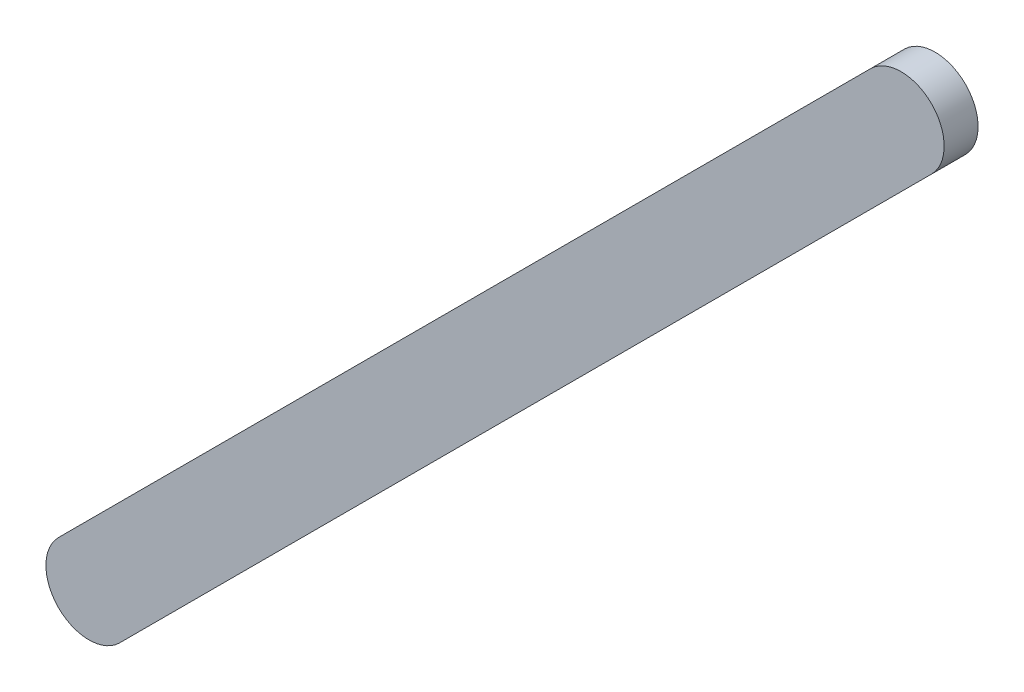
ISO-10303-21;
HEADER;
FILE_DESCRIPTION(('STEP AP214'),'2;1');
FILE_NAME('part.step','',(''),(''),'','','');
FILE_SCHEMA(('AUTOMOTIVE_DESIGN { 1 0 10303 214 1 1 1 1 }'));
ENDSEC;
DATA;
#1=APPLICATION_CONTEXT('core data for automotive mechanical design processes');
#2=APPLICATION_PROTOCOL_DEFINITION('international standard','automotive_design',2000,#1);
#3=PRODUCT_CONTEXT('',#1,'mechanical');
#4=PRODUCT('Part','Part','',(#3));
#5=PRODUCT_RELATED_PRODUCT_CATEGORY('part','',(#4));
#6=PRODUCT_DEFINITION_FORMATION('','',#4);
#7=PRODUCT_DEFINITION_CONTEXT('part definition',#1,'design');
#8=PRODUCT_DEFINITION('design','',#6,#7);
#9=PRODUCT_DEFINITION_SHAPE('','',#8);
#10=(LENGTH_UNIT() NAMED_UNIT(*) SI_UNIT(.MILLI.,.METRE.));
#11=(NAMED_UNIT(*) PLANE_ANGLE_UNIT() SI_UNIT($,.RADIAN.));
#12=(NAMED_UNIT(*) SI_UNIT($,.STERADIAN.) SOLID_ANGLE_UNIT());
#13=UNCERTAINTY_MEASURE_WITH_UNIT(LENGTH_MEASURE(1.E-05),#10,'distance_accuracy_value','');
#14=(GEOMETRIC_REPRESENTATION_CONTEXT(3) GLOBAL_UNCERTAINTY_ASSIGNED_CONTEXT((#13)) GLOBAL_UNIT_ASSIGNED_CONTEXT((#10,
#11,#12)) REPRESENTATION_CONTEXT('',''));
#15=CARTESIAN_POINT('',(0.,0.,0.));
#16=DIRECTION('',(0.,0.,1.));
#17=DIRECTION('',(1.,0.,0.));
#18=AXIS2_PLACEMENT_3D('',#15,#16,#17);
#19=CARTESIAN_POINT('',(141.8315426,59.84059406,0.));
#20=DIRECTION('',(-0.707106781186548,0.707106781186548,0.));
#21=DIRECTION('',(0.707106781186548,0.707106781186548,0.));
#22=AXIS2_PLACEMENT_3D('',#19,#20,#21);
#23=PLANE('',#22);
#24=DIRECTION('',(0.707106781186548,0.707106781186548,0.));
#25=VECTOR('',#24,1.);
#26=CARTESIAN_POINT('',(141.8315426,59.84059406,0.1999996));
#27=LINE('',#26,#25);
#28=CARTESIAN_POINT('',(141.8315426,59.84059406,0.1999996));
#29=VERTEX_POINT('',#28);
#30=CARTESIAN_POINT('',(146.62096914,64.6300206,0.1999996));
#31=VERTEX_POINT('',#30);
#32=EDGE_CURVE('E11',#29,#31,#27,.T.);
#33=ORIENTED_EDGE('',*,*,#32,.F.);
#34=DIRECTION('',(0.,0.,1.));
#35=VECTOR('',#34,1.);
#36=CARTESIAN_POINT('',(141.8315426,59.84059406,0.));
#37=LINE('',#36,#35);
#38=CARTESIAN_POINT('',(141.8315426,59.84059406,0.));
#39=VERTEX_POINT('',#38);
#40=EDGE_CURVE('E24',#39,#29,#37,.T.);
#41=ORIENTED_EDGE('',*,*,#40,.F.);
#42=DIRECTION('',(0.707106781186548,0.707106781186548,0.));
#43=VECTOR('',#42,1.);
#44=CARTESIAN_POINT('',(141.8315426,59.84059406,0.));
#45=LINE('',#44,#43);
#46=CARTESIAN_POINT('',(146.62096914,64.6300206,0.));
#47=VERTEX_POINT('',#46);
#48=EDGE_CURVE('E75',#39,#47,#45,.T.);
#49=ORIENTED_EDGE('',*,*,#48,.T.);
#50=DIRECTION('',(0.,0.,1.));
#51=VECTOR('',#50,1.);
#52=CARTESIAN_POINT('',(146.62096914,64.6300206,0.));
#53=LINE('',#52,#51);
#54=EDGE_CURVE('E37',#47,#31,#53,.T.);
#55=ORIENTED_EDGE('',*,*,#54,.T.);
#56=EDGE_LOOP('',(#33,#41,#49,#55));
#57=FACE_BOUND('',#56,.T.);
#58=ADVANCED_FACE('F17',(#57),#23,.F.);
#59=CARTESIAN_POINT('',(146.44136447,64.80962527,0.));
#60=DIRECTION('',(0.,0.,-1.));
#61=DIRECTION('',(0.707106781186548,-0.707106781186548,0.));
#62=AXIS2_PLACEMENT_3D('',#59,#60,#61);
#63=CYLINDRICAL_SURFACE('',#62,0.253999360179549);
#64=CARTESIAN_POINT('',(146.44136447,64.80962527,0.1999996));
#65=DIRECTION('',(0.,0.,1.));
#66=DIRECTION('',(0.707106781186548,-0.707106781186548,0.));
#67=AXIS2_PLACEMENT_3D('',#64,#65,#66);
#68=CIRCLE('',#67,0.253999360179549);
#69=CARTESIAN_POINT('',(146.2617598,64.98922994,0.1999996));
#70=VERTEX_POINT('',#69);
#71=EDGE_CURVE('E83',#31,#70,#68,.T.);
#72=ORIENTED_EDGE('',*,*,#71,.F.);
#73=ORIENTED_EDGE('',*,*,#54,.F.);
#74=CARTESIAN_POINT('',(146.44136447,64.80962527,0.));
#75=DIRECTION('',(0.,0.,1.));
#76=DIRECTION('',(0.707106781186548,-0.707106781186548,0.));
#77=AXIS2_PLACEMENT_3D('',#74,#75,#76);
#78=CIRCLE('',#77,0.253999360179549);
#79=CARTESIAN_POINT('',(146.2617598,64.98922994,0.));
#80=VERTEX_POINT('',#79);
#81=EDGE_CURVE('E81',#47,#80,#78,.T.);
#82=ORIENTED_EDGE('',*,*,#81,.T.);
#83=DIRECTION('',(0.,0.,1.));
#84=VECTOR('',#83,1.);
#85=CARTESIAN_POINT('',(146.2617598,64.98922994,0.));
#86=LINE('',#85,#84);
#87=EDGE_CURVE('E67',#80,#70,#86,.T.);
#88=ORIENTED_EDGE('',*,*,#87,.T.);
#89=EDGE_LOOP('',(#72,#73,#82,#88));
#90=FACE_BOUND('',#89,.T.);
#91=ADVANCED_FACE('F89',(#90),#63,.T.);
#92=CARTESIAN_POINT('',(146.2617598,64.98922994,0.));
#93=DIRECTION('',(0.707106781186546,-0.707106781186549,0.));
#94=DIRECTION('',(-0.707106781186549,-0.707106781186546,0.));
#95=AXIS2_PLACEMENT_3D('',#92,#93,#94);
#96=PLANE('',#95);
#97=DIRECTION('',(-0.707106781186549,-0.707106781186546,0.));
#98=VECTOR('',#97,1.);
#99=CARTESIAN_POINT('',(146.2617598,64.98922994,0.1999996));
#100=LINE('',#99,#98);
#101=CARTESIAN_POINT('',(141.47233326,60.1998034,0.1999996));
#102=VERTEX_POINT('',#101);
#103=EDGE_CURVE('E71',#70,#102,#100,.T.);
#104=ORIENTED_EDGE('',*,*,#103,.F.);
#105=ORIENTED_EDGE('',*,*,#87,.F.);
#106=DIRECTION('',(-0.707106781186549,-0.707106781186546,0.));
#107=VECTOR('',#106,1.);
#108=CARTESIAN_POINT('',(146.2617598,64.98922994,0.));
#109=LINE('',#108,#107);
#110=CARTESIAN_POINT('',(141.47233326,60.1998034,0.));
#111=VERTEX_POINT('',#110);
#112=EDGE_CURVE('E63',#80,#111,#109,.T.);
#113=ORIENTED_EDGE('',*,*,#112,.T.);
#114=DIRECTION('',(0.,0.,1.));
#115=VECTOR('',#114,1.);
#116=CARTESIAN_POINT('',(141.47233326,60.1998034,0.));
#117=LINE('',#116,#115);
#118=EDGE_CURVE('E53',#111,#102,#117,.T.);
#119=ORIENTED_EDGE('',*,*,#118,.T.);
#120=EDGE_LOOP('',(#104,#105,#113,#119));
#121=FACE_BOUND('',#120,.T.);
#122=ADVANCED_FACE('F66',(#121),#96,.F.);
#123=CARTESIAN_POINT('',(141.65193793,60.02019873,0.));
#124=DIRECTION('',(0.,0.,-1.));
#125=DIRECTION('',(-0.707106781186562,0.707106781186534,0.));
#126=AXIS2_PLACEMENT_3D('',#123,#124,#125);
#127=CYLINDRICAL_SURFACE('',#126,0.253999360179554);
#128=CARTESIAN_POINT('',(141.65193793,60.02019873,0.1999996));
#129=DIRECTION('',(0.,0.,1.));
#130=DIRECTION('',(-0.707106781186562,0.707106781186534,0.));
#131=AXIS2_PLACEMENT_3D('',#128,#129,#130);
#132=CIRCLE('',#131,0.253999360179554);
#133=EDGE_CURVE('E59',#102,#29,#132,.T.);
#134=ORIENTED_EDGE('',*,*,#133,.F.);
#135=ORIENTED_EDGE('',*,*,#118,.F.);
#136=CARTESIAN_POINT('',(141.65193793,60.02019873,0.));
#137=DIRECTION('',(0.,0.,1.));
#138=DIRECTION('',(-0.707106781186562,0.707106781186534,0.));
#139=AXIS2_PLACEMENT_3D('',#136,#137,#138);
#140=CIRCLE('',#139,0.253999360179554);
#141=EDGE_CURVE('E57',#111,#39,#140,.T.);
#142=ORIENTED_EDGE('',*,*,#141,.T.);
#143=ORIENTED_EDGE('',*,*,#40,.T.);
#144=EDGE_LOOP('',(#134,#135,#142,#143));
#145=FACE_BOUND('',#144,.T.);
#146=ADVANCED_FACE('F55',(#145),#127,.T.);
#147=CARTESIAN_POINT('',(141.8315426,59.84059406,0.));
#148=DIRECTION('',(0.,0.,-1.));
#149=DIRECTION('',(-1.,0.,0.));
#150=AXIS2_PLACEMENT_3D('',#147,#148,#149);
#151=PLANE('',#150);
#152=ORIENTED_EDGE('',*,*,#141,.F.);
#153=ORIENTED_EDGE('',*,*,#112,.F.);
#154=ORIENTED_EDGE('',*,*,#81,.F.);
#155=ORIENTED_EDGE('',*,*,#48,.F.);
#156=EDGE_LOOP('',(#152,#153,#154,#155));
#157=FACE_BOUND('',#156,.T.);
#158=ADVANCED_FACE('F74',(#157),#151,.T.);
#159=CARTESIAN_POINT('',(141.8315426,59.84059406,0.1999996));
#160=DIRECTION('',(0.,0.,-1.));
#161=DIRECTION('',(-1.,0.,0.));
#162=AXIS2_PLACEMENT_3D('',#159,#160,#161);
#163=PLANE('',#162);
#164=ORIENTED_EDGE('',*,*,#32,.T.);
#165=ORIENTED_EDGE('',*,*,#71,.T.);
#166=ORIENTED_EDGE('',*,*,#103,.T.);
#167=ORIENTED_EDGE('',*,*,#133,.T.);
#168=EDGE_LOOP('',(#164,#165,#166,#167));
#169=FACE_BOUND('',#168,.T.);
#170=ADVANCED_FACE('F91',(#169),#163,.F.);
#171=CLOSED_SHELL('',(#58,#91,#122,#146,#158,#170));
#172=MANIFOLD_SOLID_BREP('B1',#171);
#173=ADVANCED_BREP_SHAPE_REPRESENTATION('',(#18,#172),#14);
#174=SHAPE_DEFINITION_REPRESENTATION(#9,#173);
ENDSEC;
END-ISO-10303-21;
